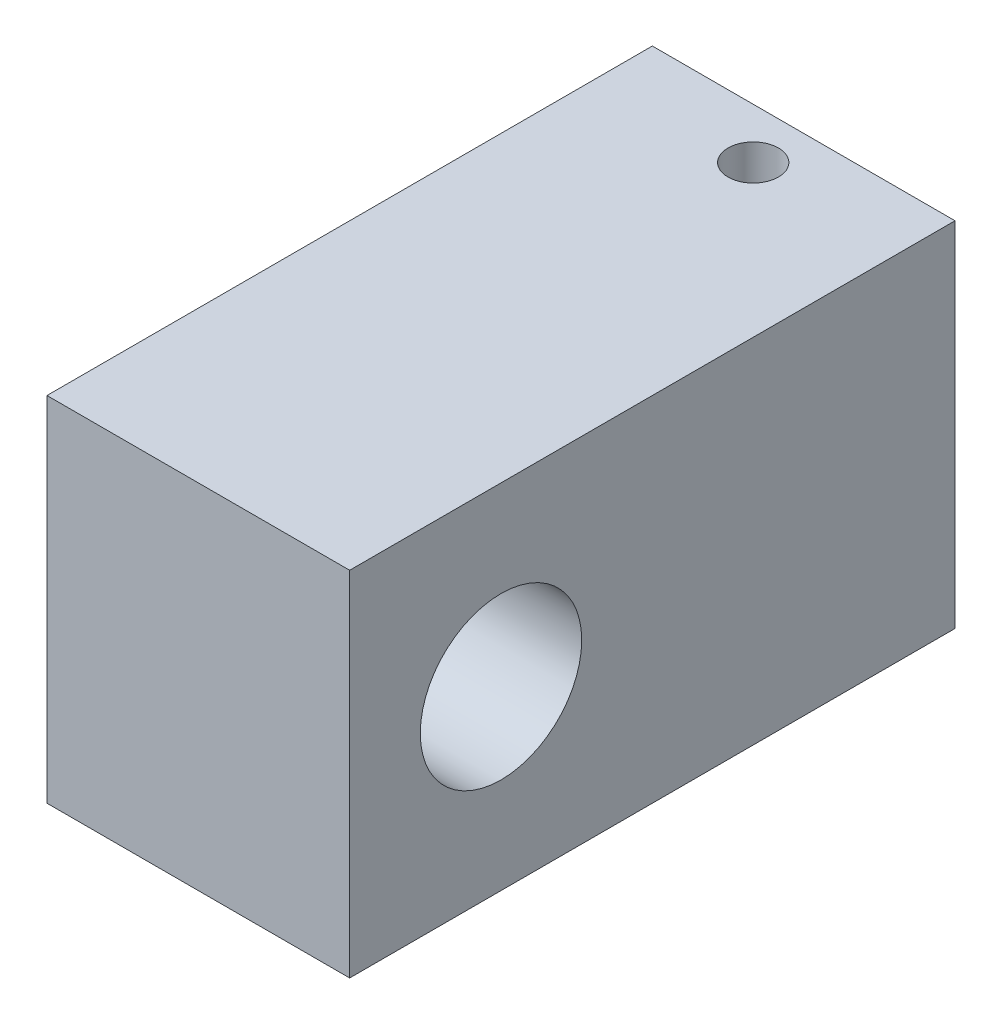
ISO-10303-21;
HEADER;
FILE_DESCRIPTION(('STEP AP214'),'2;1');
FILE_NAME('part.step','',(''),(''),'','','');
FILE_SCHEMA(('AUTOMOTIVE_DESIGN { 1 0 10303 214 1 1 1 1 }'));
ENDSEC;
DATA;
#1=APPLICATION_CONTEXT('core data for automotive mechanical design processes');
#2=APPLICATION_PROTOCOL_DEFINITION('international standard','automotive_design',2000,#1);
#3=PRODUCT_CONTEXT('',#1,'mechanical');
#4=PRODUCT('Part','Part','',(#3));
#5=PRODUCT_RELATED_PRODUCT_CATEGORY('part','',(#4));
#6=PRODUCT_DEFINITION_FORMATION('','',#4);
#7=PRODUCT_DEFINITION_CONTEXT('part definition',#1,'design');
#8=PRODUCT_DEFINITION('design','',#6,#7);
#9=PRODUCT_DEFINITION_SHAPE('','',#8);
#10=(LENGTH_UNIT() NAMED_UNIT(*) SI_UNIT(.MILLI.,.METRE.));
#11=(NAMED_UNIT(*) PLANE_ANGLE_UNIT() SI_UNIT($,.RADIAN.));
#12=(NAMED_UNIT(*) SI_UNIT($,.STERADIAN.) SOLID_ANGLE_UNIT());
#13=UNCERTAINTY_MEASURE_WITH_UNIT(LENGTH_MEASURE(1.E-05),#10,'distance_accuracy_value','');
#14=(GEOMETRIC_REPRESENTATION_CONTEXT(3) GLOBAL_UNCERTAINTY_ASSIGNED_CONTEXT((#13)) GLOBAL_UNIT_ASSIGNED_CONTEXT((#10,
#11,#12)) REPRESENTATION_CONTEXT('',''));
#15=CARTESIAN_POINT('',(0.,0.,0.));
#16=DIRECTION('',(0.,0.,1.));
#17=DIRECTION('',(1.,0.,0.));
#18=AXIS2_PLACEMENT_3D('',#15,#16,#17);
#19=CARTESIAN_POINT('',(0.,0.,60.));
#20=DIRECTION('',(1.,0.,0.));
#21=DIRECTION('',(0.,1.,0.));
#22=AXIS2_PLACEMENT_3D('',#19,#20,#21);
#23=PLANE('',#22);
#24=CARTESIAN_POINT('',(0.,17.5,45.));
#25=DIRECTION('',(1.,0.,0.));
#26=DIRECTION('',(0.,1.,0.));
#27=AXIS2_PLACEMENT_3D('',#24,#25,#26);
#28=CIRCLE('',#27,8.);
#29=CARTESIAN_POINT('',(0.,25.5,45.));
#30=VERTEX_POINT('',#29);
#31=EDGE_CURVE('E107',#30,#30,#28,.T.);
#32=ORIENTED_EDGE('',*,*,#31,.T.);
#33=EDGE_LOOP('',(#32));
#34=FACE_BOUND('',#33,.T.);
#35=DIRECTION('',(0.,-1.,0.));
#36=VECTOR('',#35,1.);
#37=CARTESIAN_POINT('',(0.,0.,0.));
#38=LINE('',#37,#36);
#39=CARTESIAN_POINT('',(0.,35.,0.));
#40=VERTEX_POINT('',#39);
#41=CARTESIAN_POINT('',(0.,0.,0.));
#42=VERTEX_POINT('',#41);
#43=EDGE_CURVE('E104',#40,#42,#38,.T.);
#44=ORIENTED_EDGE('',*,*,#43,.T.);
#45=DIRECTION('',(0.,0.,-1.));
#46=VECTOR('',#45,1.);
#47=CARTESIAN_POINT('',(0.,0.,60.));
#48=LINE('',#47,#46);
#49=CARTESIAN_POINT('',(0.,0.,60.));
#50=VERTEX_POINT('',#49);
#51=EDGE_CURVE('E11',#50,#42,#48,.T.);
#52=ORIENTED_EDGE('',*,*,#51,.F.);
#53=DIRECTION('',(0.,-1.,0.));
#54=VECTOR('',#53,1.);
#55=CARTESIAN_POINT('',(0.,0.,60.));
#56=LINE('',#55,#54);
#57=CARTESIAN_POINT('',(0.,35.,60.));
#58=VERTEX_POINT('',#57);
#59=EDGE_CURVE('E91',#58,#50,#56,.T.);
#60=ORIENTED_EDGE('',*,*,#59,.F.);
#61=DIRECTION('',(0.,0.,-1.));
#62=VECTOR('',#61,1.);
#63=CARTESIAN_POINT('',(0.,35.,60.));
#64=LINE('',#63,#62);
#65=EDGE_CURVE('E100',#58,#40,#64,.T.);
#66=ORIENTED_EDGE('',*,*,#65,.T.);
#67=EDGE_LOOP('',(#44,#52,#60,#66));
#68=FACE_BOUND('',#67,.T.);
#69=ADVANCED_FACE('F34',(#34,#68),#23,.F.);
#70=CARTESIAN_POINT('',(0.,0.,60.));
#71=DIRECTION('',(0.,1.,0.));
#72=DIRECTION('',(0.,0.,1.));
#73=AXIS2_PLACEMENT_3D('',#70,#71,#72);
#74=PLANE('',#73);
#75=DIRECTION('',(1.,0.,0.));
#76=VECTOR('',#75,1.);
#77=CARTESIAN_POINT('',(0.,0.,0.));
#78=LINE('',#77,#76);
#79=CARTESIAN_POINT('',(30.,0.,0.));
#80=VERTEX_POINT('',#79);
#81=EDGE_CURVE('E95',#42,#80,#78,.T.);
#82=ORIENTED_EDGE('',*,*,#81,.T.);
#83=DIRECTION('',(0.,0.,-1.));
#84=VECTOR('',#83,1.);
#85=CARTESIAN_POINT('',(30.,0.,60.));
#86=LINE('',#85,#84);
#87=CARTESIAN_POINT('',(30.,0.,60.));
#88=VERTEX_POINT('',#87);
#89=EDGE_CURVE('E48',#88,#80,#86,.T.);
#90=ORIENTED_EDGE('',*,*,#89,.F.);
#91=DIRECTION('',(1.,0.,0.));
#92=VECTOR('',#91,1.);
#93=CARTESIAN_POINT('',(0.,0.,60.));
#94=LINE('',#93,#92);
#95=EDGE_CURVE('E86',#50,#88,#94,.T.);
#96=ORIENTED_EDGE('',*,*,#95,.F.);
#97=ORIENTED_EDGE('',*,*,#51,.T.);
#98=EDGE_LOOP('',(#82,#90,#96,#97));
#99=FACE_BOUND('',#98,.T.);
#100=ADVANCED_FACE('F94',(#99),#74,.F.);
#101=CARTESIAN_POINT('',(30.,0.,60.));
#102=DIRECTION('',(-1.,0.,0.));
#103=DIRECTION('',(0.,-1.,0.));
#104=AXIS2_PLACEMENT_3D('',#101,#102,#103);
#105=PLANE('',#104);
#106=CARTESIAN_POINT('',(30.,17.5,45.));
#107=DIRECTION('',(1.,0.,0.));
#108=DIRECTION('',(0.,1.,0.));
#109=AXIS2_PLACEMENT_3D('',#106,#107,#108);
#110=CIRCLE('',#109,8.);
#111=CARTESIAN_POINT('',(30.,25.5,45.));
#112=VERTEX_POINT('',#111);
#113=EDGE_CURVE('E118',#112,#112,#110,.T.);
#114=ORIENTED_EDGE('',*,*,#113,.F.);
#115=EDGE_LOOP('',(#114));
#116=FACE_BOUND('',#115,.T.);
#117=DIRECTION('',(0.,1.,0.));
#118=VECTOR('',#117,1.);
#119=CARTESIAN_POINT('',(30.,0.,0.));
#120=LINE('',#119,#118);
#121=CARTESIAN_POINT('',(30.,35.,0.));
#122=VERTEX_POINT('',#121);
#123=EDGE_CURVE('E73',#80,#122,#120,.T.);
#124=ORIENTED_EDGE('',*,*,#123,.T.);
#125=DIRECTION('',(0.,0.,-1.));
#126=VECTOR('',#125,1.);
#127=CARTESIAN_POINT('',(30.,35.,60.));
#128=LINE('',#127,#126);
#129=CARTESIAN_POINT('',(30.,35.,60.));
#130=VERTEX_POINT('',#129);
#131=EDGE_CURVE('E96',#130,#122,#128,.T.);
#132=ORIENTED_EDGE('',*,*,#131,.F.);
#133=DIRECTION('',(0.,1.,0.));
#134=VECTOR('',#133,1.);
#135=CARTESIAN_POINT('',(30.,0.,60.));
#136=LINE('',#135,#134);
#137=EDGE_CURVE('E89',#88,#130,#136,.T.);
#138=ORIENTED_EDGE('',*,*,#137,.F.);
#139=ORIENTED_EDGE('',*,*,#89,.T.);
#140=EDGE_LOOP('',(#124,#132,#138,#139));
#141=FACE_BOUND('',#140,.T.);
#142=ADVANCED_FACE('F98',(#116,#141),#105,.F.);
#143=CARTESIAN_POINT('',(0.,35.,60.));
#144=DIRECTION('',(0.,-1.,0.));
#145=DIRECTION('',(0.,0.,-1.));
#146=AXIS2_PLACEMENT_3D('',#143,#144,#145);
#147=PLANE('',#146);
#148=CARTESIAN_POINT('',(15.,35.,5.));
#149=DIRECTION('',(0.,1.,0.));
#150=DIRECTION('',(0.,0.,1.));
#151=AXIS2_PLACEMENT_3D('',#148,#149,#150);
#152=CIRCLE('',#151,2.5);
#153=CARTESIAN_POINT('',(15.,35.,7.5));
#154=VERTEX_POINT('',#153);
#155=EDGE_CURVE('E129',#154,#154,#152,.T.);
#156=ORIENTED_EDGE('',*,*,#155,.F.);
#157=EDGE_LOOP('',(#156));
#158=FACE_BOUND('',#157,.T.);
#159=DIRECTION('',(-1.,0.,0.));
#160=VECTOR('',#159,1.);
#161=CARTESIAN_POINT('',(0.,35.,0.));
#162=LINE('',#161,#160);
#163=EDGE_CURVE('E79',#122,#40,#162,.T.);
#164=ORIENTED_EDGE('',*,*,#163,.T.);
#165=ORIENTED_EDGE('',*,*,#65,.F.);
#166=DIRECTION('',(-1.,0.,0.));
#167=VECTOR('',#166,1.);
#168=CARTESIAN_POINT('',(0.,35.,60.));
#169=LINE('',#168,#167);
#170=EDGE_CURVE('E56',#130,#58,#169,.T.);
#171=ORIENTED_EDGE('',*,*,#170,.F.);
#172=ORIENTED_EDGE('',*,*,#131,.T.);
#173=EDGE_LOOP('',(#164,#165,#171,#172));
#174=FACE_BOUND('',#173,.T.);
#175=ADVANCED_FACE('F112',(#158,#174),#147,.F.);
#176=CARTESIAN_POINT('',(0.,0.,60.));
#177=DIRECTION('',(0.,0.,-1.));
#178=DIRECTION('',(-1.,0.,0.));
#179=AXIS2_PLACEMENT_3D('',#176,#177,#178);
#180=PLANE('',#179);
#181=ORIENTED_EDGE('',*,*,#59,.T.);
#182=ORIENTED_EDGE('',*,*,#95,.T.);
#183=ORIENTED_EDGE('',*,*,#137,.T.);
#184=ORIENTED_EDGE('',*,*,#170,.T.);
#185=EDGE_LOOP('',(#181,#182,#183,#184));
#186=FACE_BOUND('',#185,.T.);
#187=ADVANCED_FACE('F87',(#186),#180,.F.);
#188=CARTESIAN_POINT('',(0.,0.,0.));
#189=DIRECTION('',(0.,0.,-1.));
#190=DIRECTION('',(-1.,0.,0.));
#191=AXIS2_PLACEMENT_3D('',#188,#189,#190);
#192=PLANE('',#191);
#193=CARTESIAN_POINT('',(15.,17.5,0.));
#194=DIRECTION('',(0.,0.,-1.));
#195=DIRECTION('',(-1.,0.,0.));
#196=AXIS2_PLACEMENT_3D('',#193,#194,#195);
#197=CIRCLE('',#196,5.);
#198=CARTESIAN_POINT('',(9.99999999999999,17.5,0.));
#199=VERTEX_POINT('',#198);
#200=EDGE_CURVE('E124',#199,#199,#197,.T.);
#201=ORIENTED_EDGE('',*,*,#200,.F.);
#202=EDGE_LOOP('',(#201));
#203=FACE_BOUND('',#202,.T.);
#204=ORIENTED_EDGE('',*,*,#43,.F.);
#205=ORIENTED_EDGE('',*,*,#163,.F.);
#206=ORIENTED_EDGE('',*,*,#123,.F.);
#207=ORIENTED_EDGE('',*,*,#81,.F.);
#208=EDGE_LOOP('',(#204,#205,#206,#207));
#209=FACE_BOUND('',#208,.T.);
#210=ADVANCED_FACE('F115',(#203,#209),#192,.T.);
#211=CARTESIAN_POINT('',(0.,17.5,45.));
#212=DIRECTION('',(1.,0.,0.));
#213=DIRECTION('',(0.,1.,0.));
#214=AXIS2_PLACEMENT_3D('',#211,#212,#213);
#215=CYLINDRICAL_SURFACE('',#214,8.);
#216=ORIENTED_EDGE('',*,*,#31,.F.);
#217=EDGE_LOOP('',(#216));
#218=FACE_BOUND('',#217,.T.);
#219=ORIENTED_EDGE('',*,*,#113,.T.);
#220=EDGE_LOOP('',(#219));
#221=FACE_BOUND('',#220,.T.);
#222=ADVANCED_FACE('F155',(#218,#221),#215,.F.);
#223=CARTESIAN_POINT('',(15.,17.5,10.));
#224=DIRECTION('',(0.,0.,-1.));
#225=DIRECTION('',(-1.,0.,0.));
#226=AXIS2_PLACEMENT_3D('',#223,#224,#225);
#227=CYLINDRICAL_SURFACE('',#226,5.);
#228=CARTESIAN_POINT('',(15.,22.5,7.5));
#229=CARTESIAN_POINT('',(15.1314266823343,22.4999917755047,7.49999033094399));
#230=CARTESIAN_POINT('',(15.2630156344372,22.4947619913528,7.48957443822597));
#231=CARTESIAN_POINT('',(15.5223014546229,22.4743541856102,7.44836817883794));
#232=CARTESIAN_POINT('',(15.6499904485641,22.4591572718767,7.41753911907498));
#233=CARTESIAN_POINT('',(15.8973336313162,22.4204069092248,7.33701537728115));
#234=CARTESIAN_POINT('',(16.0170169453628,22.3968859590726,7.28739401221727));
#235=CARTESIAN_POINT('',(16.2461816039967,22.3436444332583,7.1710734737482));
#236=CARTESIAN_POINT('',(16.3556637520377,22.3139243464442,7.1043756468549));
#237=CARTESIAN_POINT('',(16.56876952631,22.2489064505063,6.95120686835737));
#238=CARTESIAN_POINT('',(16.6716380229431,22.2133799765909,6.86378379977021));
#239=CARTESIAN_POINT('',(16.8619486170333,22.1414992577673,6.6736963040147));
#240=CARTESIAN_POINT('',(16.9493789591155,22.105144405669,6.57102037115988));
#241=CARTESIAN_POINT('',(17.1131299996725,22.0324737794562,6.34379162555472));
#242=CARTESIAN_POINT('',(17.1880633384906,21.9963796741257,6.21815975396499));
#243=CARTESIAN_POINT('',(17.3154205676149,21.9321494694356,5.95408166020456));
#244=CARTESIAN_POINT('',(17.3678605375168,21.9040076902079,5.81564467823738));
#245=CARTESIAN_POINT('',(17.4453311053765,21.861446675914,5.53833723640358));
#246=CARTESIAN_POINT('',(17.4718146426758,21.8463067895845,5.39998886982042));
#247=CARTESIAN_POINT('',(17.5010674832974,21.8295472487215,5.12005290556239));
#248=CARTESIAN_POINT('',(17.503860220939,21.8279142335843,4.9784686478249));
#249=CARTESIAN_POINT('',(17.4867182179251,21.8377732564294,4.71428493920912));
#250=CARTESIAN_POINT('',(17.4694613988405,21.8477190915498,4.59143992194171));
#251=CARTESIAN_POINT('',(17.4173496226438,21.8769057183468,4.35069522656805));
#252=CARTESIAN_POINT('',(17.3824890597445,21.8961494707945,4.23279713673689));
#253=CARTESIAN_POINT('',(17.2955244509646,21.9421869103184,4.00192716858566));
#254=CARTESIAN_POINT('',(17.2430376677899,21.9691460165999,3.88913400303547));
#255=CARTESIAN_POINT('',(17.1226042191701,22.0275851070351,3.67341426852503));
#256=CARTESIAN_POINT('',(17.0546506095312,22.0590671195048,3.57049216099979));
#257=CARTESIAN_POINT('',(16.8951651372819,22.1278289475821,3.36369686814192));
#258=CARTESIAN_POINT('',(16.8017361459232,22.1653377559187,3.2613578160596));
#259=CARTESIAN_POINT('',(16.5988889468534,22.2386905825102,3.07316145352275));
#260=CARTESIAN_POINT('',(16.4894631414357,22.27453379897,2.98731201991529));
#261=CARTESIAN_POINT('',(16.2512912645796,22.3425496820741,2.83078584742568));
#262=CARTESIAN_POINT('',(16.1218839789985,22.3744746040502,2.76099881888564));
#263=CARTESIAN_POINT('',(15.851165538722,22.4289470280311,2.64475742739248));
#264=CARTESIAN_POINT('',(15.7098639406632,22.4515019735889,2.5982845374621));
#265=CARTESIAN_POINT('',(15.4319162291518,22.4831083435358,2.53381149070829));
#266=CARTESIAN_POINT('',(15.2958538263709,22.4931234575324,2.513771910633));
#267=CARTESIAN_POINT('',(15.0219489998733,22.5018253364779,2.49633817216383));
#268=CARTESIAN_POINT('',(14.8841074503249,22.5005174680343,2.4989332859015));
#269=CARTESIAN_POINT('',(14.6219175700353,22.4872798063347,2.5255167210467));
#270=CARTESIAN_POINT('',(14.4973514798763,22.4761811421999,2.5478313318244));
#271=CARTESIAN_POINT('',(14.253982769244,22.4455542828753,2.61059517973838));
#272=CARTESIAN_POINT('',(14.1351807857681,22.4260251583762,2.65104641613589));
#273=CARTESIAN_POINT('',(13.9027784788803,22.3796062853233,2.74999616608036));
#274=CARTESIAN_POINT('',(13.7894240075017,22.3525220441787,2.80897762528232));
#275=CARTESIAN_POINT('',(13.5738465957356,22.2935993579975,2.94276883912482));
#276=CARTESIAN_POINT('',(13.471628425498,22.2617588894053,3.01758533651988));
#277=CARTESIAN_POINT('',(13.2705807768451,22.1927055331509,3.18940106329089));
#278=CARTESIAN_POINT('',(13.173069805715,22.1552721200949,3.2878571709752));
#279=CARTESIAN_POINT('',(12.9953591974278,22.0815597892159,3.49981287804944));
#280=CARTESIAN_POINT('',(12.9151715357131,22.0452816847241,3.61332279706987));
#281=CARTESIAN_POINT('',(12.77073021381,21.9762798054528,3.85910913548465));
#282=CARTESIAN_POINT('',(12.7074362607776,21.9438132398125,3.99202816529114));
#283=CARTESIAN_POINT('',(12.6047929348854,21.8893518072675,4.26877516888255));
#284=CARTESIAN_POINT('',(12.5654127092294,21.8673434554901,4.41258881599999));
#285=CARTESIAN_POINT('',(12.5153457823299,21.8390375256935,4.69227555736294));
#286=CARTESIAN_POINT('',(12.5022675125564,21.831434586741,4.82758563411897));
#287=CARTESIAN_POINT('',(12.498277110491,21.8291338659258,5.09861766738068));
#288=CARTESIAN_POINT('',(12.5073553701673,21.8344304902511,5.23433941987363));
#289=CARTESIAN_POINT('',(12.5451846980267,21.8559465516466,5.48870875561685));
#290=CARTESIAN_POINT('',(12.571979256973,21.8710773633813,5.60775118172076));
#291=CARTESIAN_POINT('',(12.6420615615946,21.909275403376,5.83952029219995));
#292=CARTESIAN_POINT('',(12.6853546127127,21.9323451843497,5.95224493156654));
#293=CARTESIAN_POINT('',(12.7904608068446,21.9857132643341,6.17656215271972));
#294=CARTESIAN_POINT('',(12.853322809906,22.0163930799845,6.28756985173501));
#295=CARTESIAN_POINT('',(12.9946219161201,22.0808832707746,6.49818624324004));
#296=CARTESIAN_POINT('',(13.0730671223411,22.1146952697077,6.59778896262873));
#297=CARTESIAN_POINT('',(13.2544944305393,22.1865581632701,6.79535536374964));
#298=CARTESIAN_POINT('',(13.3592997753079,22.2246249151498,6.89164936417137));
#299=CARTESIAN_POINT('',(13.5846021457932,22.2969434738355,7.06565584942804));
#300=CARTESIAN_POINT('',(13.7051075757367,22.3311932190545,7.14335831860588));
#301=CARTESIAN_POINT('',(13.9602119112146,22.3924514945778,7.2780969794841));
#302=CARTESIAN_POINT('',(14.0949044392177,22.4194071143749,7.33498316778445));
#303=CARTESIAN_POINT('',(14.3036712907426,22.4517796092335,7.40218385879239));
#304=CARTESIAN_POINT('',(14.3743295865059,22.4612231408187,7.42155539800181));
#305=CARTESIAN_POINT('',(14.5173760021607,22.477171272751,7.45406594837059));
#306=CARTESIAN_POINT('',(14.5897630369076,22.4836776682316,7.46720876667634));
#307=CARTESIAN_POINT('',(14.7184813153783,22.4923820076613,7.48473747228463));
#308=CARTESIAN_POINT('',(14.7745915004446,22.4952328846645,7.49045493653132));
#309=CARTESIAN_POINT('',(14.8871244715437,22.4990436732966,7.49808832946571));
#310=CARTESIAN_POINT('',(14.9435472661618,22.500003532732,7.50000415322547));
#311=CARTESIAN_POINT('',(15.,22.5,7.5));
#312=B_SPLINE_CURVE_WITH_KNOTS('',3,(#228,#229,#230,#231,#232,#233,#234,#235,#236,#237,#238,
#239,#240,#241,#242,#243,#244,#245,#246,#247,#248,#249,#250,#251,#252,#253,#254,#255,#256,#257,
#258,#259,#260,#261,#262,#263,#264,#265,#266,#267,#268,#269,#270,#271,#272,#273,#274,#275,#276,
#277,#278,#279,#280,#281,#282,#283,#284,#285,#286,#287,#288,#289,#290,#291,#292,#293,#294,#295,
#296,#297,#298,#299,#300,#301,#302,#303,#304,#305,#306,#307,#308,#309,#310,#311),.UNSPECIFIED.,
.T.,.F.,(4,2,2,2,2,2,2,2,2,2,2,2,2,2,2,2,2,2,2,2,2,2,2,2,2,2,2,2,2,2,2,2,2,2,2,2,2,2,2,2,2,4),
(0.,0.39406064355073,0.788870374272993,1.18215538873074,1.57540940145392,1.99245439679522,
2.40981559413509,2.85954316076882,3.30894869745702,3.73145030350573,4.15353393322551,
4.52514281023301,4.89687009814196,5.27725600421218,5.65781303150554,6.08662353334696,
6.51563836496715,6.96457555536101,7.41315542280698,7.82458226178364,8.23581411278689,
8.61517266265304,8.99457304077328,9.38482140069746,9.77523626870847,10.2039902661037,
10.6330397153795,11.0828670540368,11.53211279863,11.9382326875698,12.3441764966106,
12.7114482562151,13.0788382197025,13.4709114195009,13.8631890285844,14.303131068923,
14.7433095845248,15.1866003415818,15.407934939208,15.6291340766843,15.7983933645035,
15.9676573239322),.UNSPECIFIED.);
#313=CARTESIAN_POINT('',(15.,22.5,7.5));
#314=VERTEX_POINT('',#313);
#315=EDGE_CURVE('E37',#314,#314,#312,.T.);
#316=ORIENTED_EDGE('',*,*,#315,.T.);
#317=EDGE_LOOP('',(#316));
#318=FACE_BOUND('',#317,.T.);
#319=CARTESIAN_POINT('',(15.,17.5,10.));
#320=DIRECTION('',(0.,0.,-1.));
#321=DIRECTION('',(-1.,0.,0.));
#322=AXIS2_PLACEMENT_3D('',#319,#320,#321);
#323=CIRCLE('',#322,5.);
#324=CARTESIAN_POINT('',(9.99999999999999,17.5,10.));
#325=VERTEX_POINT('',#324);
#326=EDGE_CURVE('E121',#325,#325,#323,.T.);
#327=ORIENTED_EDGE('',*,*,#326,.F.);
#328=EDGE_LOOP('',(#327));
#329=FACE_BOUND('',#328,.T.);
#330=ORIENTED_EDGE('',*,*,#200,.T.);
#331=EDGE_LOOP('',(#330));
#332=FACE_BOUND('',#331,.T.);
#333=ADVANCED_FACE('F136',(#318,#329,#332),#227,.F.);
#334=CARTESIAN_POINT('',(15.,17.5,10.));
#335=DIRECTION('',(0.,0.,-1.));
#336=DIRECTION('',(-1.,0.,0.));
#337=AXIS2_PLACEMENT_3D('',#334,#335,#336);
#338=PLANE('',#337);
#339=ORIENTED_EDGE('',*,*,#326,.T.);
#340=EDGE_LOOP('',(#339));
#341=FACE_BOUND('',#340,.T.);
#342=ADVANCED_FACE('F141',(#341),#338,.T.);
#343=CARTESIAN_POINT('',(15.,20.,5.));
#344=DIRECTION('',(0.,1.,0.));
#345=DIRECTION('',(0.,0.,1.));
#346=AXIS2_PLACEMENT_3D('',#343,#344,#345);
#347=CYLINDRICAL_SURFACE('',#346,2.5);
#348=ORIENTED_EDGE('',*,*,#155,.T.);
#349=EDGE_LOOP('',(#348));
#350=FACE_BOUND('',#349,.T.);
#351=ORIENTED_EDGE('',*,*,#315,.F.);
#352=EDGE_LOOP('',(#351));
#353=FACE_BOUND('',#352,.T.);
#354=ADVANCED_FACE('F139',(#350,#353),#347,.F.);
#355=CLOSED_SHELL('',(#69,#100,#142,#175,#187,#210,#222,#333,#342,#354));
#356=MANIFOLD_SOLID_BREP('B2',#355);
#357=ADVANCED_BREP_SHAPE_REPRESENTATION('',(#18,#356),#14);
#358=SHAPE_DEFINITION_REPRESENTATION(#9,#357);
ENDSEC;
END-ISO-10303-21;
